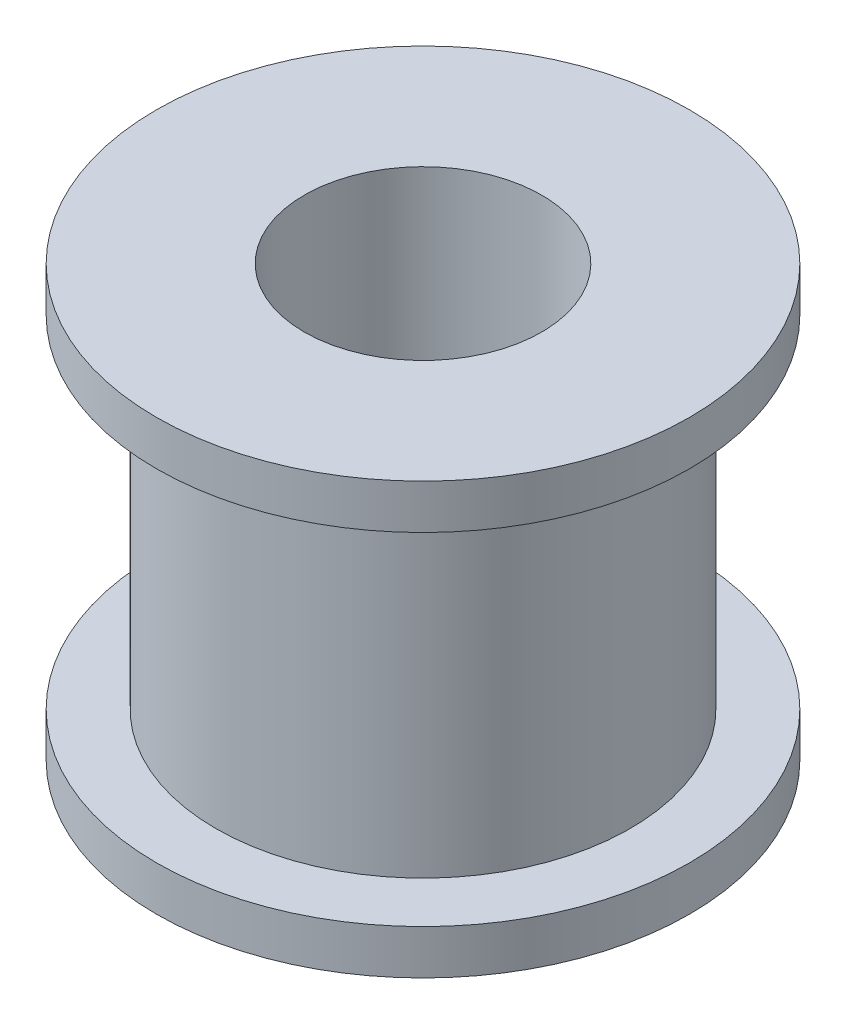
ISO-10303-21;
HEADER;
FILE_DESCRIPTION(('STEP AP214'),'2;1');
FILE_NAME('part.step','',(''),(''),'','','');
FILE_SCHEMA(('AUTOMOTIVE_DESIGN { 1 0 10303 214 1 1 1 1 }'));
ENDSEC;
DATA;
#1=APPLICATION_CONTEXT('core data for automotive mechanical design processes');
#2=APPLICATION_PROTOCOL_DEFINITION('international standard','automotive_design',2000,#1);
#3=PRODUCT_CONTEXT('',#1,'mechanical');
#4=PRODUCT('Part','Part','',(#3));
#5=PRODUCT_RELATED_PRODUCT_CATEGORY('part','',(#4));
#6=PRODUCT_DEFINITION_FORMATION('','',#4);
#7=PRODUCT_DEFINITION_CONTEXT('part definition',#1,'design');
#8=PRODUCT_DEFINITION('design','',#6,#7);
#9=PRODUCT_DEFINITION_SHAPE('','',#8);
#10=(LENGTH_UNIT() NAMED_UNIT(*) SI_UNIT(.MILLI.,.METRE.));
#11=(NAMED_UNIT(*) PLANE_ANGLE_UNIT() SI_UNIT($,.RADIAN.));
#12=(NAMED_UNIT(*) SI_UNIT($,.STERADIAN.) SOLID_ANGLE_UNIT());
#13=UNCERTAINTY_MEASURE_WITH_UNIT(LENGTH_MEASURE(1.E-05),#10,'distance_accuracy_value','');
#14=(GEOMETRIC_REPRESENTATION_CONTEXT(3) GLOBAL_UNCERTAINTY_ASSIGNED_CONTEXT((#13)) GLOBAL_UNIT_ASSIGNED_CONTEXT((#10,
#11,#12)) REPRESENTATION_CONTEXT('',''));
#15=CARTESIAN_POINT('',(0.,0.,0.));
#16=DIRECTION('',(0.,0.,1.));
#17=DIRECTION('',(1.,0.,0.));
#18=AXIS2_PLACEMENT_3D('',#15,#16,#17);
#19=CARTESIAN_POINT('',(0.,10.3155225102178,0.));
#20=DIRECTION('',(0.,1.,0.));
#21=DIRECTION('',(0.,0.,1.));
#22=AXIS2_PLACEMENT_3D('',#19,#20,#21);
#23=CYLINDRICAL_SURFACE('',#22,8.98);
#24=CARTESIAN_POINT('',(0.,-5.75,0.));
#25=DIRECTION('',(0.,1.,0.));
#26=DIRECTION('',(0.,0.,1.));
#27=AXIS2_PLACEMENT_3D('',#24,#25,#26);
#28=CIRCLE('',#27,8.98);
#29=CARTESIAN_POINT('',(0.,-5.75,8.98));
#30=VERTEX_POINT('',#29);
#31=EDGE_CURVE('E71',#30,#30,#28,.T.);
#32=ORIENTED_EDGE('',*,*,#31,.F.);
#33=EDGE_LOOP('',(#32));
#34=FACE_BOUND('',#33,.T.);
#35=CARTESIAN_POINT('',(0.,-7.25,0.));
#36=DIRECTION('',(0.,1.,0.));
#37=DIRECTION('',(0.,0.,1.));
#38=AXIS2_PLACEMENT_3D('',#35,#36,#37);
#39=CIRCLE('',#38,8.98);
#40=CARTESIAN_POINT('',(0.,-7.25,8.98));
#41=VERTEX_POINT('',#40);
#42=EDGE_CURVE('E10',#41,#41,#39,.T.);
#43=ORIENTED_EDGE('',*,*,#42,.T.);
#44=EDGE_LOOP('',(#43));
#45=FACE_BOUND('',#44,.T.);
#46=ADVANCED_FACE('F36',(#34,#45),#23,.T.);
#47=CARTESIAN_POINT('',(0.,-7.25,-8.98));
#48=DIRECTION('',(0.,1.,0.));
#49=DIRECTION('',(0.,0.,1.));
#50=AXIS2_PLACEMENT_3D('',#47,#48,#49);
#51=PLANE('',#50);
#52=ORIENTED_EDGE('',*,*,#42,.F.);
#53=EDGE_LOOP('',(#52));
#54=FACE_BOUND('',#53,.T.);
#55=CARTESIAN_POINT('',(0.,-7.25,0.));
#56=DIRECTION('',(0.,1.,0.));
#57=DIRECTION('',(0.,0.,1.));
#58=AXIS2_PLACEMENT_3D('',#55,#56,#57);
#59=CIRCLE('',#58,4.);
#60=CARTESIAN_POINT('',(0.,-7.25,4.));
#61=VERTEX_POINT('',#60);
#62=EDGE_CURVE('E43',#61,#61,#59,.T.);
#63=ORIENTED_EDGE('',*,*,#62,.T.);
#64=EDGE_LOOP('',(#63));
#65=FACE_BOUND('',#64,.T.);
#66=ADVANCED_FACE('F79',(#54,#65),#51,.F.);
#67=CARTESIAN_POINT('',(0.,10.3155225102178,0.));
#68=DIRECTION('',(0.,1.,0.));
#69=DIRECTION('',(0.,0.,1.));
#70=AXIS2_PLACEMENT_3D('',#67,#68,#69);
#71=CYLINDRICAL_SURFACE('',#70,4.);
#72=ORIENTED_EDGE('',*,*,#62,.F.);
#73=EDGE_LOOP('',(#72));
#74=FACE_BOUND('',#73,.T.);
#75=CARTESIAN_POINT('',(0.,7.25,0.));
#76=DIRECTION('',(0.,1.,0.));
#77=DIRECTION('',(0.,0.,1.));
#78=AXIS2_PLACEMENT_3D('',#75,#76,#77);
#79=CIRCLE('',#78,4.);
#80=CARTESIAN_POINT('',(0.,7.25,4.));
#81=VERTEX_POINT('',#80);
#82=EDGE_CURVE('E48',#81,#81,#79,.T.);
#83=ORIENTED_EDGE('',*,*,#82,.T.);
#84=EDGE_LOOP('',(#83));
#85=FACE_BOUND('',#84,.T.);
#86=ADVANCED_FACE('F83',(#74,#85),#71,.F.);
#87=CARTESIAN_POINT('',(0.,7.25,-8.98));
#88=DIRECTION('',(0.,-1.,0.));
#89=DIRECTION('',(0.,0.,-1.));
#90=AXIS2_PLACEMENT_3D('',#87,#88,#89);
#91=PLANE('',#90);
#92=ORIENTED_EDGE('',*,*,#82,.F.);
#93=EDGE_LOOP('',(#92));
#94=FACE_BOUND('',#93,.T.);
#95=CARTESIAN_POINT('',(0.,7.25,0.));
#96=DIRECTION('',(0.,1.,0.));
#97=DIRECTION('',(0.,0.,1.));
#98=AXIS2_PLACEMENT_3D('',#95,#96,#97);
#99=CIRCLE('',#98,8.98);
#100=CARTESIAN_POINT('',(0.,7.25,8.98));
#101=VERTEX_POINT('',#100);
#102=EDGE_CURVE('E53',#101,#101,#99,.T.);
#103=ORIENTED_EDGE('',*,*,#102,.T.);
#104=EDGE_LOOP('',(#103));
#105=FACE_BOUND('',#104,.T.);
#106=ADVANCED_FACE('F88',(#94,#105),#91,.F.);
#107=CARTESIAN_POINT('',(0.,10.3155225102178,0.));
#108=DIRECTION('',(0.,1.,0.));
#109=DIRECTION('',(0.,0.,1.));
#110=AXIS2_PLACEMENT_3D('',#107,#108,#109);
#111=CYLINDRICAL_SURFACE('',#110,8.98);
#112=ORIENTED_EDGE('',*,*,#102,.F.);
#113=EDGE_LOOP('',(#112));
#114=FACE_BOUND('',#113,.T.);
#115=CARTESIAN_POINT('',(0.,5.75,0.));
#116=DIRECTION('',(0.,1.,0.));
#117=DIRECTION('',(0.,0.,1.));
#118=AXIS2_PLACEMENT_3D('',#115,#116,#117);
#119=CIRCLE('',#118,8.98);
#120=CARTESIAN_POINT('',(0.,5.75,8.98));
#121=VERTEX_POINT('',#120);
#122=EDGE_CURVE('E59',#121,#121,#119,.T.);
#123=ORIENTED_EDGE('',*,*,#122,.T.);
#124=EDGE_LOOP('',(#123));
#125=FACE_BOUND('',#124,.T.);
#126=ADVANCED_FACE('F94',(#114,#125),#111,.T.);
#127=CARTESIAN_POINT('',(0.,5.75,-6.98));
#128=DIRECTION('',(0.,1.,0.));
#129=DIRECTION('',(0.,0.,1.));
#130=AXIS2_PLACEMENT_3D('',#127,#128,#129);
#131=PLANE('',#130);
#132=ORIENTED_EDGE('',*,*,#122,.F.);
#133=EDGE_LOOP('',(#132));
#134=FACE_BOUND('',#133,.T.);
#135=CARTESIAN_POINT('',(0.,5.75,0.));
#136=DIRECTION('',(0.,1.,0.));
#137=DIRECTION('',(0.,0.,1.));
#138=AXIS2_PLACEMENT_3D('',#135,#136,#137);
#139=CIRCLE('',#138,6.98);
#140=CARTESIAN_POINT('',(0.,5.75,6.98));
#141=VERTEX_POINT('',#140);
#142=EDGE_CURVE('E63',#141,#141,#139,.T.);
#143=ORIENTED_EDGE('',*,*,#142,.T.);
#144=EDGE_LOOP('',(#143));
#145=FACE_BOUND('',#144,.T.);
#146=ADVANCED_FACE('F98',(#134,#145),#131,.F.);
#147=CARTESIAN_POINT('',(0.,10.3155225102178,0.));
#148=DIRECTION('',(0.,1.,0.));
#149=DIRECTION('',(0.,0.,1.));
#150=AXIS2_PLACEMENT_3D('',#147,#148,#149);
#151=CYLINDRICAL_SURFACE('',#150,6.98);
#152=ORIENTED_EDGE('',*,*,#142,.F.);
#153=EDGE_LOOP('',(#152));
#154=FACE_BOUND('',#153,.T.);
#155=CARTESIAN_POINT('',(0.,-5.75,0.));
#156=DIRECTION('',(0.,1.,0.));
#157=DIRECTION('',(0.,0.,1.));
#158=AXIS2_PLACEMENT_3D('',#155,#156,#157);
#159=CIRCLE('',#158,6.98);
#160=CARTESIAN_POINT('',(0.,-5.75,6.98));
#161=VERTEX_POINT('',#160);
#162=EDGE_CURVE('E67',#161,#161,#159,.T.);
#163=ORIENTED_EDGE('',*,*,#162,.T.);
#164=EDGE_LOOP('',(#163));
#165=FACE_BOUND('',#164,.T.);
#166=ADVANCED_FACE('F102',(#154,#165),#151,.T.);
#167=CARTESIAN_POINT('',(0.,-5.75,-6.98));
#168=DIRECTION('',(0.,-1.,0.));
#169=DIRECTION('',(0.,0.,-1.));
#170=AXIS2_PLACEMENT_3D('',#167,#168,#169);
#171=PLANE('',#170);
#172=ORIENTED_EDGE('',*,*,#162,.F.);
#173=EDGE_LOOP('',(#172));
#174=FACE_BOUND('',#173,.T.);
#175=ORIENTED_EDGE('',*,*,#31,.T.);
#176=EDGE_LOOP('',(#175));
#177=FACE_BOUND('',#176,.T.);
#178=ADVANCED_FACE('F76',(#174,#177),#171,.F.);
#179=CLOSED_SHELL('',(#46,#66,#86,#106,#126,#146,#166,#178));
#180=MANIFOLD_SOLID_BREP('B2',#179);
#181=ADVANCED_BREP_SHAPE_REPRESENTATION('',(#18,#180),#14);
#182=SHAPE_DEFINITION_REPRESENTATION(#9,#181);
ENDSEC;
END-ISO-10303-21;
